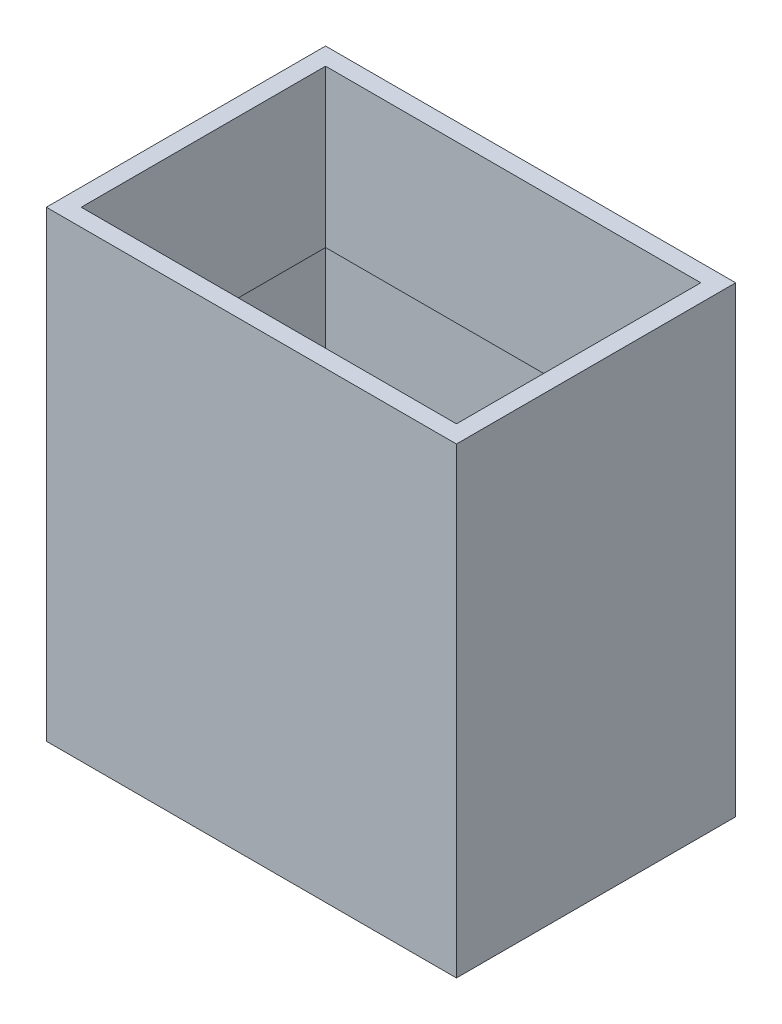
ISO-10303-21;
HEADER;
FILE_DESCRIPTION(('STEP AP214'),'2;1');
FILE_NAME('part.step','',(''),(''),'','','');
FILE_SCHEMA(('AUTOMOTIVE_DESIGN { 1 0 10303 214 1 1 1 1 }'));
ENDSEC;
DATA;
#1=APPLICATION_CONTEXT('core data for automotive mechanical design processes');
#2=APPLICATION_PROTOCOL_DEFINITION('international standard','automotive_design',2000,#1);
#3=PRODUCT_CONTEXT('',#1,'mechanical');
#4=PRODUCT('Part','Part','',(#3));
#5=PRODUCT_RELATED_PRODUCT_CATEGORY('part','',(#4));
#6=PRODUCT_DEFINITION_FORMATION('','',#4);
#7=PRODUCT_DEFINITION_CONTEXT('part definition',#1,'design');
#8=PRODUCT_DEFINITION('design','',#6,#7);
#9=PRODUCT_DEFINITION_SHAPE('','',#8);
#10=(LENGTH_UNIT() NAMED_UNIT(*) SI_UNIT(.MILLI.,.METRE.));
#11=(NAMED_UNIT(*) PLANE_ANGLE_UNIT() SI_UNIT($,.RADIAN.));
#12=(NAMED_UNIT(*) SI_UNIT($,.STERADIAN.) SOLID_ANGLE_UNIT());
#13=UNCERTAINTY_MEASURE_WITH_UNIT(LENGTH_MEASURE(1.E-05),#10,'distance_accuracy_value','');
#14=(GEOMETRIC_REPRESENTATION_CONTEXT(3) GLOBAL_UNCERTAINTY_ASSIGNED_CONTEXT((#13)) GLOBAL_UNIT_ASSIGNED_CONTEXT((#10,
#11,#12)) REPRESENTATION_CONTEXT('',''));
#15=CARTESIAN_POINT('',(0.,0.,0.));
#16=DIRECTION('',(0.,0.,1.));
#17=DIRECTION('',(1.,0.,0.));
#18=AXIS2_PLACEMENT_3D('',#15,#16,#17);
#19=CARTESIAN_POINT('',(0.,28.,0.));
#20=DIRECTION('',(0.,-1.,0.));
#21=DIRECTION('',(0.,0.,-1.));
#22=AXIS2_PLACEMENT_3D('',#19,#20,#21);
#23=PLANE('',#22);
#24=DIRECTION('',(0.,0.,1.));
#25=VECTOR('',#24,1.);
#26=CARTESIAN_POINT('',(0.,28.,0.));
#27=LINE('',#26,#25);
#28=CARTESIAN_POINT('',(0.,28.,-32.));
#29=VERTEX_POINT('',#28);
#30=CARTESIAN_POINT('',(0.,28.,0.));
#31=VERTEX_POINT('',#30);
#32=EDGE_CURVE('E188',#29,#31,#27,.T.);
#33=ORIENTED_EDGE('',*,*,#32,.T.);
#34=DIRECTION('',(1.,0.,0.));
#35=VECTOR('',#34,1.);
#36=CARTESIAN_POINT('',(0.,28.,0.));
#37=LINE('',#36,#35);
#38=CARTESIAN_POINT('',(47.,28.,0.));
#39=VERTEX_POINT('',#38);
#40=EDGE_CURVE('E191',#31,#39,#37,.T.);
#41=ORIENTED_EDGE('',*,*,#40,.T.);
#42=DIRECTION('',(0.,0.,-1.));
#43=VECTOR('',#42,1.);
#44=CARTESIAN_POINT('',(47.,28.,0.));
#45=LINE('',#44,#43);
#46=CARTESIAN_POINT('',(47.,28.,-32.));
#47=VERTEX_POINT('',#46);
#48=EDGE_CURVE('E193',#39,#47,#45,.T.);
#49=ORIENTED_EDGE('',*,*,#48,.T.);
#50=DIRECTION('',(-1.,0.,0.));
#51=VECTOR('',#50,1.);
#52=CARTESIAN_POINT('',(0.,28.,-32.));
#53=LINE('',#52,#51);
#54=EDGE_CURVE('E195',#47,#29,#53,.T.);
#55=ORIENTED_EDGE('',*,*,#54,.T.);
#56=EDGE_LOOP('',(#33,#41,#49,#55));
#57=FACE_BOUND('',#56,.T.);
#58=DIRECTION('',(0.,0.,1.));
#59=VECTOR('',#58,1.);
#60=CARTESIAN_POINT('',(2.,28.,-2.));
#61=LINE('',#60,#59);
#62=CARTESIAN_POINT('',(2.,28.,-30.));
#63=VERTEX_POINT('',#62);
#64=CARTESIAN_POINT('',(2.,28.,-2.));
#65=VERTEX_POINT('',#64);
#66=EDGE_CURVE('E167',#63,#65,#61,.T.);
#67=ORIENTED_EDGE('',*,*,#66,.F.);
#68=DIRECTION('',(-1.,0.,0.));
#69=VECTOR('',#68,1.);
#70=CARTESIAN_POINT('',(2.,28.,-30.));
#71=LINE('',#70,#69);
#72=CARTESIAN_POINT('',(45.,28.,-30.));
#73=VERTEX_POINT('',#72);
#74=EDGE_CURVE('E174',#73,#63,#71,.T.);
#75=ORIENTED_EDGE('',*,*,#74,.F.);
#76=DIRECTION('',(0.,0.,-1.));
#77=VECTOR('',#76,1.);
#78=CARTESIAN_POINT('',(45.,28.,-2.));
#79=LINE('',#78,#77);
#80=CARTESIAN_POINT('',(45.,28.,-2.));
#81=VERTEX_POINT('',#80);
#82=EDGE_CURVE('E171',#81,#73,#79,.T.);
#83=ORIENTED_EDGE('',*,*,#82,.F.);
#84=DIRECTION('',(1.,0.,0.));
#85=VECTOR('',#84,1.);
#86=CARTESIAN_POINT('',(2.,28.,-2.));
#87=LINE('',#86,#85);
#88=EDGE_CURVE('E169',#65,#81,#87,.T.);
#89=ORIENTED_EDGE('',*,*,#88,.F.);
#90=EDGE_LOOP('',(#67,#75,#83,#89));
#91=FACE_BOUND('',#90,.T.);
#92=ADVANCED_FACE('F41',(#57,#91),#23,.F.);
#93=CARTESIAN_POINT('',(0.,28.,0.));
#94=DIRECTION('',(1.,0.,0.));
#95=DIRECTION('',(0.,0.,-1.));
#96=AXIS2_PLACEMENT_3D('',#93,#94,#95);
#97=PLANE('',#96);
#98=DIRECTION('',(0.,-1.,0.));
#99=VECTOR('',#98,1.);
#100=CARTESIAN_POINT('',(0.,28.,-32.));
#101=LINE('',#100,#99);
#102=CARTESIAN_POINT('',(0.,-25.,-32.));
#103=VERTEX_POINT('',#102);
#104=EDGE_CURVE('E197',#29,#103,#101,.T.);
#105=ORIENTED_EDGE('',*,*,#104,.T.);
#106=DIRECTION('',(0.,0.,-1.));
#107=VECTOR('',#106,1.);
#108=CARTESIAN_POINT('',(0.,-25.,-32.));
#109=LINE('',#108,#107);
#110=CARTESIAN_POINT('',(0.,-25.,0.));
#111=VERTEX_POINT('',#110);
#112=EDGE_CURVE('E145',#111,#103,#109,.T.);
#113=ORIENTED_EDGE('',*,*,#112,.F.);
#114=DIRECTION('',(0.,-1.,0.));
#115=VECTOR('',#114,1.);
#116=CARTESIAN_POINT('',(0.,28.,0.));
#117=LINE('',#116,#115);
#118=EDGE_CURVE('E203',#31,#111,#117,.T.);
#119=ORIENTED_EDGE('',*,*,#118,.F.);
#120=ORIENTED_EDGE('',*,*,#32,.F.);
#121=EDGE_LOOP('',(#105,#113,#119,#120));
#122=FACE_BOUND('',#121,.T.);
#123=ADVANCED_FACE('F43',(#122),#97,.F.);
#124=CARTESIAN_POINT('',(0.,28.,0.));
#125=DIRECTION('',(0.,0.,-1.));
#126=DIRECTION('',(-1.,0.,0.));
#127=AXIS2_PLACEMENT_3D('',#124,#125,#126);
#128=PLANE('',#127);
#129=ORIENTED_EDGE('',*,*,#118,.T.);
#130=DIRECTION('',(-1.,0.,0.));
#131=VECTOR('',#130,1.);
#132=CARTESIAN_POINT('',(0.,-25.,0.));
#133=LINE('',#132,#131);
#134=CARTESIAN_POINT('',(47.,-25.,0.));
#135=VERTEX_POINT('',#134);
#136=EDGE_CURVE('E263',#135,#111,#133,.T.);
#137=ORIENTED_EDGE('',*,*,#136,.F.);
#138=DIRECTION('',(0.,-1.,0.));
#139=VECTOR('',#138,1.);
#140=CARTESIAN_POINT('',(47.,28.,0.));
#141=LINE('',#140,#139);
#142=EDGE_CURVE('E201',#39,#135,#141,.T.);
#143=ORIENTED_EDGE('',*,*,#142,.F.);
#144=ORIENTED_EDGE('',*,*,#40,.F.);
#145=EDGE_LOOP('',(#129,#137,#143,#144));
#146=FACE_BOUND('',#145,.T.);
#147=ADVANCED_FACE('F297',(#146),#128,.F.);
#148=CARTESIAN_POINT('',(47.,28.,0.));
#149=DIRECTION('',(-1.,0.,0.));
#150=DIRECTION('',(0.,0.,1.));
#151=AXIS2_PLACEMENT_3D('',#148,#149,#150);
#152=PLANE('',#151);
#153=ORIENTED_EDGE('',*,*,#142,.T.);
#154=DIRECTION('',(0.,0.,1.));
#155=VECTOR('',#154,1.);
#156=CARTESIAN_POINT('',(47.,-25.,-32.));
#157=LINE('',#156,#155);
#158=CARTESIAN_POINT('',(47.,-25.,-32.));
#159=VERTEX_POINT('',#158);
#160=EDGE_CURVE('E260',#159,#135,#157,.T.);
#161=ORIENTED_EDGE('',*,*,#160,.F.);
#162=DIRECTION('',(0.,-1.,0.));
#163=VECTOR('',#162,1.);
#164=CARTESIAN_POINT('',(47.,28.,-32.));
#165=LINE('',#164,#163);
#166=EDGE_CURVE('E199',#47,#159,#165,.T.);
#167=ORIENTED_EDGE('',*,*,#166,.F.);
#168=ORIENTED_EDGE('',*,*,#48,.F.);
#169=EDGE_LOOP('',(#153,#161,#167,#168));
#170=FACE_BOUND('',#169,.T.);
#171=ADVANCED_FACE('F307',(#170),#152,.F.);
#172=CARTESIAN_POINT('',(0.,28.,-32.));
#173=DIRECTION('',(0.,0.,1.));
#174=DIRECTION('',(1.,0.,0.));
#175=AXIS2_PLACEMENT_3D('',#172,#173,#174);
#176=PLANE('',#175);
#177=ORIENTED_EDGE('',*,*,#166,.T.);
#178=DIRECTION('',(1.,0.,0.));
#179=VECTOR('',#178,1.);
#180=CARTESIAN_POINT('',(0.,-25.,-32.));
#181=LINE('',#180,#179);
#182=EDGE_CURVE('E257',#103,#159,#181,.T.);
#183=ORIENTED_EDGE('',*,*,#182,.F.);
#184=ORIENTED_EDGE('',*,*,#104,.F.);
#185=ORIENTED_EDGE('',*,*,#54,.F.);
#186=EDGE_LOOP('',(#177,#183,#184,#185));
#187=FACE_BOUND('',#186,.T.);
#188=ADVANCED_FACE('F304',(#187),#176,.F.);
#189=CARTESIAN_POINT('',(2.,28.,-2.));
#190=DIRECTION('',(1.,0.,0.));
#191=DIRECTION('',(0.,0.,-1.));
#192=AXIS2_PLACEMENT_3D('',#189,#190,#191);
#193=PLANE('',#192);
#194=DIRECTION('',(0.,0.,1.));
#195=VECTOR('',#194,1.);
#196=CARTESIAN_POINT('',(2.,10.,-2.));
#197=LINE('',#196,#195);
#198=CARTESIAN_POINT('',(2.,10.,-30.));
#199=VERTEX_POINT('',#198);
#200=CARTESIAN_POINT('',(2.,10.,-2.));
#201=VERTEX_POINT('',#200);
#202=EDGE_CURVE('E165',#199,#201,#197,.T.);
#203=ORIENTED_EDGE('',*,*,#202,.F.);
#204=DIRECTION('',(0.,-1.,0.));
#205=VECTOR('',#204,1.);
#206=CARTESIAN_POINT('',(2.,28.,-30.));
#207=LINE('',#206,#205);
#208=EDGE_CURVE('E176',#63,#199,#207,.T.);
#209=ORIENTED_EDGE('',*,*,#208,.F.);
#210=ORIENTED_EDGE('',*,*,#66,.T.);
#211=DIRECTION('',(0.,-1.,0.));
#212=VECTOR('',#211,1.);
#213=CARTESIAN_POINT('',(2.,28.,-2.));
#214=LINE('',#213,#212);
#215=EDGE_CURVE('E185',#65,#201,#214,.T.);
#216=ORIENTED_EDGE('',*,*,#215,.T.);
#217=EDGE_LOOP('',(#203,#209,#210,#216));
#218=FACE_BOUND('',#217,.T.);
#219=ADVANCED_FACE('F302',(#218),#193,.T.);
#220=CARTESIAN_POINT('',(2.,28.,-2.));
#221=DIRECTION('',(0.,0.,-1.));
#222=DIRECTION('',(-1.,0.,0.));
#223=AXIS2_PLACEMENT_3D('',#220,#221,#222);
#224=PLANE('',#223);
#225=DIRECTION('',(1.,0.,0.));
#226=VECTOR('',#225,1.);
#227=CARTESIAN_POINT('',(2.,10.,-2.));
#228=LINE('',#227,#226);
#229=CARTESIAN_POINT('',(45.,10.,-2.));
#230=VERTEX_POINT('',#229);
#231=EDGE_CURVE('E163',#201,#230,#228,.T.);
#232=ORIENTED_EDGE('',*,*,#231,.F.);
#233=ORIENTED_EDGE('',*,*,#215,.F.);
#234=ORIENTED_EDGE('',*,*,#88,.T.);
#235=DIRECTION('',(0.,-1.,0.));
#236=VECTOR('',#235,1.);
#237=CARTESIAN_POINT('',(45.,28.,-2.));
#238=LINE('',#237,#236);
#239=EDGE_CURVE('E182',#81,#230,#238,.T.);
#240=ORIENTED_EDGE('',*,*,#239,.T.);
#241=EDGE_LOOP('',(#232,#233,#234,#240));
#242=FACE_BOUND('',#241,.T.);
#243=ADVANCED_FACE('F544',(#242),#224,.T.);
#244=CARTESIAN_POINT('',(45.,28.,-2.));
#245=DIRECTION('',(-1.,0.,0.));
#246=DIRECTION('',(0.,0.,1.));
#247=AXIS2_PLACEMENT_3D('',#244,#245,#246);
#248=PLANE('',#247);
#249=DIRECTION('',(0.,0.,-1.));
#250=VECTOR('',#249,1.);
#251=CARTESIAN_POINT('',(45.,10.,-2.));
#252=LINE('',#251,#250);
#253=CARTESIAN_POINT('',(45.,10.,-30.));
#254=VERTEX_POINT('',#253);
#255=EDGE_CURVE('E64',#230,#254,#252,.T.);
#256=ORIENTED_EDGE('',*,*,#255,.F.);
#257=ORIENTED_EDGE('',*,*,#239,.F.);
#258=ORIENTED_EDGE('',*,*,#82,.T.);
#259=DIRECTION('',(0.,-1.,0.));
#260=VECTOR('',#259,1.);
#261=CARTESIAN_POINT('',(45.,28.,-30.));
#262=LINE('',#261,#260);
#263=EDGE_CURVE('E179',#73,#254,#262,.T.);
#264=ORIENTED_EDGE('',*,*,#263,.T.);
#265=EDGE_LOOP('',(#256,#257,#258,#264));
#266=FACE_BOUND('',#265,.T.);
#267=ADVANCED_FACE('F534',(#266),#248,.T.);
#268=CARTESIAN_POINT('',(2.,28.,-30.));
#269=DIRECTION('',(0.,0.,1.));
#270=DIRECTION('',(1.,0.,0.));
#271=AXIS2_PLACEMENT_3D('',#268,#269,#270);
#272=PLANE('',#271);
#273=DIRECTION('',(-1.,0.,0.));
#274=VECTOR('',#273,1.);
#275=CARTESIAN_POINT('',(2.,10.,-30.));
#276=LINE('',#275,#274);
#277=EDGE_CURVE('E136',#254,#199,#276,.T.);
#278=ORIENTED_EDGE('',*,*,#277,.F.);
#279=ORIENTED_EDGE('',*,*,#263,.F.);
#280=ORIENTED_EDGE('',*,*,#74,.T.);
#281=ORIENTED_EDGE('',*,*,#208,.T.);
#282=EDGE_LOOP('',(#278,#279,#280,#281));
#283=FACE_BOUND('',#282,.T.);
#284=ADVANCED_FACE('F525',(#283),#272,.T.);
#285=CARTESIAN_POINT('',(1.5,10.,-30.5));
#286=DIRECTION('',(-1.,0.,0.));
#287=DIRECTION('',(0.,0.,1.));
#288=AXIS2_PLACEMENT_3D('',#285,#286,#287);
#289=PLANE('',#288);
#290=DIRECTION('',(0.,-1.,0.));
#291=VECTOR('',#290,1.);
#292=CARTESIAN_POINT('',(1.5,10.,-1.5));
#293=LINE('',#292,#291);
#294=CARTESIAN_POINT('',(1.5,10.,-1.5));
#295=VERTEX_POINT('',#294);
#296=CARTESIAN_POINT('',(1.5,-22.,-1.5));
#297=VERTEX_POINT('',#296);
#298=EDGE_CURVE('E144',#295,#297,#293,.T.);
#299=ORIENTED_EDGE('',*,*,#298,.T.);
#300=DIRECTION('',(0.,0.,-1.));
#301=VECTOR('',#300,1.);
#302=CARTESIAN_POINT('',(1.5,-22.,-30.5));
#303=LINE('',#302,#301);
#304=CARTESIAN_POINT('',(1.5,-22.,-30.5));
#305=VERTEX_POINT('',#304);
#306=EDGE_CURVE('E130',#297,#305,#303,.T.);
#307=ORIENTED_EDGE('',*,*,#306,.T.);
#308=DIRECTION('',(0.,-1.,0.));
#309=VECTOR('',#308,1.);
#310=CARTESIAN_POINT('',(1.5,10.,-30.5));
#311=LINE('',#310,#309);
#312=CARTESIAN_POINT('',(1.5,10.,-30.5));
#313=VERTEX_POINT('',#312);
#314=EDGE_CURVE('E142',#313,#305,#311,.T.);
#315=ORIENTED_EDGE('',*,*,#314,.F.);
#316=DIRECTION('',(0.,0.,-1.));
#317=VECTOR('',#316,1.);
#318=CARTESIAN_POINT('',(1.5,10.,-30.5));
#319=LINE('',#318,#317);
#320=EDGE_CURVE('E266',#295,#313,#319,.T.);
#321=ORIENTED_EDGE('',*,*,#320,.F.);
#322=EDGE_LOOP('',(#299,#307,#315,#321));
#323=FACE_BOUND('',#322,.T.);
#324=ADVANCED_FACE('F140',(#323),#289,.F.);
#325=CARTESIAN_POINT('',(1.5,10.,-1.5));
#326=DIRECTION('',(0.,0.,1.));
#327=DIRECTION('',(1.,0.,0.));
#328=AXIS2_PLACEMENT_3D('',#325,#326,#327);
#329=PLANE('',#328);
#330=DIRECTION('',(0.,-1.,0.));
#331=VECTOR('',#330,1.);
#332=CARTESIAN_POINT('',(45.5,10.,-1.5));
#333=LINE('',#332,#331);
#334=CARTESIAN_POINT('',(45.5,10.,-1.5));
#335=VERTEX_POINT('',#334);
#336=CARTESIAN_POINT('',(45.5,-22.,-1.5));
#337=VERTEX_POINT('',#336);
#338=EDGE_CURVE('E155',#335,#337,#333,.T.);
#339=ORIENTED_EDGE('',*,*,#338,.T.);
#340=DIRECTION('',(-1.,0.,0.));
#341=VECTOR('',#340,1.);
#342=CARTESIAN_POINT('',(1.5,-22.,-1.5));
#343=LINE('',#342,#341);
#344=EDGE_CURVE('E146',#337,#297,#343,.T.);
#345=ORIENTED_EDGE('',*,*,#344,.T.);
#346=ORIENTED_EDGE('',*,*,#298,.F.);
#347=DIRECTION('',(-1.,0.,0.));
#348=VECTOR('',#347,1.);
#349=CARTESIAN_POINT('',(1.5,10.,-1.5));
#350=LINE('',#349,#348);
#351=EDGE_CURVE('E153',#335,#295,#350,.T.);
#352=ORIENTED_EDGE('',*,*,#351,.F.);
#353=EDGE_LOOP('',(#339,#345,#346,#352));
#354=FACE_BOUND('',#353,.T.);
#355=ADVANCED_FACE('F274',(#354),#329,.F.);
#356=CARTESIAN_POINT('',(45.5,10.,-30.5));
#357=DIRECTION('',(1.,0.,0.));
#358=DIRECTION('',(0.,0.,-1.));
#359=AXIS2_PLACEMENT_3D('',#356,#357,#358);
#360=PLANE('',#359);
#361=DIRECTION('',(0.,-1.,0.));
#362=VECTOR('',#361,1.);
#363=CARTESIAN_POINT('',(45.5,10.,-30.5));
#364=LINE('',#363,#362);
#365=CARTESIAN_POINT('',(45.5,10.,-30.5));
#366=VERTEX_POINT('',#365);
#367=CARTESIAN_POINT('',(45.5,-22.,-30.5));
#368=VERTEX_POINT('',#367);
#369=EDGE_CURVE('E152',#366,#368,#364,.T.);
#370=ORIENTED_EDGE('',*,*,#369,.T.);
#371=DIRECTION('',(0.,0.,1.));
#372=VECTOR('',#371,1.);
#373=CARTESIAN_POINT('',(45.5,-22.,-30.5));
#374=LINE('',#373,#372);
#375=EDGE_CURVE('E56',#368,#337,#374,.T.);
#376=ORIENTED_EDGE('',*,*,#375,.T.);
#377=ORIENTED_EDGE('',*,*,#338,.F.);
#378=DIRECTION('',(0.,0.,1.));
#379=VECTOR('',#378,1.);
#380=CARTESIAN_POINT('',(45.5,10.,-30.5));
#381=LINE('',#380,#379);
#382=EDGE_CURVE('E158',#366,#335,#381,.T.);
#383=ORIENTED_EDGE('',*,*,#382,.F.);
#384=EDGE_LOOP('',(#370,#376,#377,#383));
#385=FACE_BOUND('',#384,.T.);
#386=ADVANCED_FACE('F277',(#385),#360,.F.);
#387=CARTESIAN_POINT('',(1.5,10.,-30.5));
#388=DIRECTION('',(0.,0.,-1.));
#389=DIRECTION('',(-1.,0.,0.));
#390=AXIS2_PLACEMENT_3D('',#387,#388,#389);
#391=PLANE('',#390);
#392=ORIENTED_EDGE('',*,*,#314,.T.);
#393=DIRECTION('',(1.,0.,0.));
#394=VECTOR('',#393,1.);
#395=CARTESIAN_POINT('',(1.5,-22.,-30.5));
#396=LINE('',#395,#394);
#397=EDGE_CURVE('E127',#305,#368,#396,.T.);
#398=ORIENTED_EDGE('',*,*,#397,.T.);
#399=ORIENTED_EDGE('',*,*,#369,.F.);
#400=DIRECTION('',(1.,0.,0.));
#401=VECTOR('',#400,1.);
#402=CARTESIAN_POINT('',(1.5,10.,-30.5));
#403=LINE('',#402,#401);
#404=EDGE_CURVE('E150',#313,#366,#403,.T.);
#405=ORIENTED_EDGE('',*,*,#404,.F.);
#406=EDGE_LOOP('',(#392,#398,#399,#405));
#407=FACE_BOUND('',#406,.T.);
#408=ADVANCED_FACE('F148',(#407),#391,.F.);
#409=CARTESIAN_POINT('',(0.,10.,0.));
#410=DIRECTION('',(0.,1.,0.));
#411=DIRECTION('',(0.,0.,1.));
#412=AXIS2_PLACEMENT_3D('',#409,#410,#411);
#413=PLANE('',#412);
#414=ORIENTED_EDGE('',*,*,#202,.T.);
#415=ORIENTED_EDGE('',*,*,#231,.T.);
#416=ORIENTED_EDGE('',*,*,#255,.T.);
#417=ORIENTED_EDGE('',*,*,#277,.T.);
#418=EDGE_LOOP('',(#414,#415,#416,#417));
#419=FACE_BOUND('',#418,.T.);
#420=ORIENTED_EDGE('',*,*,#320,.T.);
#421=ORIENTED_EDGE('',*,*,#404,.T.);
#422=ORIENTED_EDGE('',*,*,#382,.T.);
#423=ORIENTED_EDGE('',*,*,#351,.T.);
#424=EDGE_LOOP('',(#420,#421,#422,#423));
#425=FACE_BOUND('',#424,.T.);
#426=ADVANCED_FACE('F279',(#419,#425),#413,.F.);
#427=CARTESIAN_POINT('',(0.,-25.,0.));
#428=DIRECTION('',(0.,1.,0.));
#429=DIRECTION('',(0.,0.,1.));
#430=AXIS2_PLACEMENT_3D('',#427,#428,#429);
#431=PLANE('',#430);
#432=ORIENTED_EDGE('',*,*,#112,.T.);
#433=ORIENTED_EDGE('',*,*,#182,.T.);
#434=ORIENTED_EDGE('',*,*,#160,.T.);
#435=ORIENTED_EDGE('',*,*,#136,.T.);
#436=EDGE_LOOP('',(#432,#433,#434,#435));
#437=FACE_BOUND('',#436,.T.);
#438=CARTESIAN_POINT('',(23.5,-25.,-16.));
#439=DIRECTION('',(0.,-1.,0.));
#440=DIRECTION('',(0.,0.,-1.));
#441=AXIS2_PLACEMENT_3D('',#438,#439,#440);
#442=CIRCLE('',#441,6.50000000000001);
#443=CARTESIAN_POINT('',(23.5,-25.,-22.5));
#444=VERTEX_POINT('',#443);
#445=EDGE_CURVE('E209',#444,#444,#442,.T.);
#446=ORIENTED_EDGE('',*,*,#445,.F.);
#447=EDGE_LOOP('',(#446));
#448=FACE_BOUND('',#447,.T.);
#449=ADVANCED_FACE('F281',(#437,#448),#431,.F.);
#450=CARTESIAN_POINT('',(0.,-22.,0.));
#451=DIRECTION('',(0.,1.,0.));
#452=DIRECTION('',(0.,0.,1.));
#453=AXIS2_PLACEMENT_3D('',#450,#451,#452);
#454=PLANE('',#453);
#455=CARTESIAN_POINT('',(37.,-22.,-16.));
#456=DIRECTION('',(0.,1.,0.));
#457=DIRECTION('',(0.,0.,1.));
#458=AXIS2_PLACEMENT_3D('',#455,#456,#457);
#459=CIRCLE('',#458,5.);
#460=CARTESIAN_POINT('',(37.,-22.,-11.));
#461=VERTEX_POINT('',#460);
#462=EDGE_CURVE('E213',#461,#461,#459,.T.);
#463=ORIENTED_EDGE('',*,*,#462,.F.);
#464=EDGE_LOOP('',(#463));
#465=FACE_BOUND('',#464,.T.);
#466=CARTESIAN_POINT('',(10.,-22.,-16.));
#467=DIRECTION('',(0.,1.,0.));
#468=DIRECTION('',(0.,0.,1.));
#469=AXIS2_PLACEMENT_3D('',#466,#467,#468);
#470=CIRCLE('',#469,5.);
#471=CARTESIAN_POINT('',(10.,-22.,-11.));
#472=VERTEX_POINT('',#471);
#473=EDGE_CURVE('E135',#472,#472,#470,.T.);
#474=ORIENTED_EDGE('',*,*,#473,.F.);
#475=EDGE_LOOP('',(#474));
#476=FACE_BOUND('',#475,.T.);
#477=CARTESIAN_POINT('',(23.5,-22.,-16.));
#478=DIRECTION('',(0.,-1.,0.));
#479=DIRECTION('',(0.,0.,-1.));
#480=AXIS2_PLACEMENT_3D('',#477,#478,#479);
#481=CIRCLE('',#480,6.50000000000001);
#482=CARTESIAN_POINT('',(23.5,-22.,-22.5));
#483=VERTEX_POINT('',#482);
#484=EDGE_CURVE('E248',#483,#483,#481,.T.);
#485=ORIENTED_EDGE('',*,*,#484,.T.);
#486=EDGE_LOOP('',(#485));
#487=FACE_BOUND('',#486,.T.);
#488=ORIENTED_EDGE('',*,*,#306,.F.);
#489=ORIENTED_EDGE('',*,*,#344,.F.);
#490=ORIENTED_EDGE('',*,*,#375,.F.);
#491=ORIENTED_EDGE('',*,*,#397,.F.);
#492=EDGE_LOOP('',(#488,#489,#490,#491));
#493=FACE_BOUND('',#492,.T.);
#494=ADVANCED_FACE('F129',(#465,#476,#487,#493),#454,.T.);
#495=CARTESIAN_POINT('',(23.5,-22.,-16.));
#496=DIRECTION('',(0.,-1.,0.));
#497=DIRECTION('',(0.,0.,-1.));
#498=AXIS2_PLACEMENT_3D('',#495,#496,#497);
#499=CYLINDRICAL_SURFACE('',#498,6.50000000000001);
#500=ORIENTED_EDGE('',*,*,#484,.F.);
#501=EDGE_LOOP('',(#500));
#502=FACE_BOUND('',#501,.T.);
#503=ORIENTED_EDGE('',*,*,#445,.T.);
#504=EDGE_LOOP('',(#503));
#505=FACE_BOUND('',#504,.T.);
#506=ADVANCED_FACE('F329',(#502,#505),#499,.F.);
#507=CARTESIAN_POINT('',(10.,-20.,-16.));
#508=DIRECTION('',(0.,-1.,0.));
#509=DIRECTION('',(0.,0.,-1.));
#510=AXIS2_PLACEMENT_3D('',#507,#508,#509);
#511=CYLINDRICAL_SURFACE('',#510,5.);
#512=ORIENTED_EDGE('',*,*,#473,.T.);
#513=EDGE_LOOP('',(#512));
#514=FACE_BOUND('',#513,.T.);
#515=CARTESIAN_POINT('',(10.,-20.,-16.));
#516=DIRECTION('',(0.,-1.,0.));
#517=DIRECTION('',(0.,0.,-1.));
#518=AXIS2_PLACEMENT_3D('',#515,#516,#517);
#519=CIRCLE('',#518,5.);
#520=CARTESIAN_POINT('',(10.,-20.,-21.));
#521=VERTEX_POINT('',#520);
#522=EDGE_CURVE('E210',#521,#521,#519,.T.);
#523=ORIENTED_EDGE('',*,*,#522,.T.);
#524=EDGE_LOOP('',(#523));
#525=FACE_BOUND('',#524,.T.);
#526=ADVANCED_FACE('F331',(#514,#525),#511,.T.);
#527=CARTESIAN_POINT('',(10.,-20.,-16.));
#528=DIRECTION('',(0.,-1.,0.));
#529=DIRECTION('',(0.,0.,-1.));
#530=AXIS2_PLACEMENT_3D('',#527,#528,#529);
#531=PLANE('',#530);
#532=CARTESIAN_POINT('',(10.,-20.,-16.));
#533=DIRECTION('',(0.,-1.,0.));
#534=DIRECTION('',(0.,0.,-1.));
#535=AXIS2_PLACEMENT_3D('',#532,#533,#534);
#536=CIRCLE('',#535,4.);
#537=CARTESIAN_POINT('',(10.,-20.,-20.));
#538=VERTEX_POINT('',#537);
#539=EDGE_CURVE('E217',#538,#538,#536,.T.);
#540=ORIENTED_EDGE('',*,*,#539,.T.);
#541=EDGE_LOOP('',(#540));
#542=FACE_BOUND('',#541,.T.);
#543=ORIENTED_EDGE('',*,*,#522,.F.);
#544=EDGE_LOOP('',(#543));
#545=FACE_BOUND('',#544,.T.);
#546=ADVANCED_FACE('F237',(#542,#545),#531,.F.);
#547=CARTESIAN_POINT('',(10.,-20.,-16.));
#548=DIRECTION('',(0.,-1.,0.));
#549=DIRECTION('',(0.,0.,-1.));
#550=AXIS2_PLACEMENT_3D('',#547,#548,#549);
#551=CYLINDRICAL_SURFACE('',#550,4.);
#552=CARTESIAN_POINT('',(10.,-22.,-16.));
#553=DIRECTION('',(0.,1.,0.));
#554=DIRECTION('',(0.,0.,1.));
#555=AXIS2_PLACEMENT_3D('',#552,#553,#554);
#556=CIRCLE('',#555,4.);
#557=CARTESIAN_POINT('',(10.,-22.,-12.));
#558=VERTEX_POINT('',#557);
#559=EDGE_CURVE('E206',#558,#558,#556,.T.);
#560=ORIENTED_EDGE('',*,*,#559,.F.);
#561=EDGE_LOOP('',(#560));
#562=FACE_BOUND('',#561,.T.);
#563=ORIENTED_EDGE('',*,*,#539,.F.);
#564=EDGE_LOOP('',(#563));
#565=FACE_BOUND('',#564,.T.);
#566=ADVANCED_FACE('F230',(#562,#565),#551,.F.);
#567=CARTESIAN_POINT('',(10.,-22.,-16.));
#568=DIRECTION('',(0.,1.,0.));
#569=DIRECTION('',(0.,0.,1.));
#570=AXIS2_PLACEMENT_3D('',#567,#568,#569);
#571=CIRCLE('',#570,2.65);
#572=CARTESIAN_POINT('',(10.,-22.,-13.35));
#573=VERTEX_POINT('',#572);
#574=EDGE_CURVE('E49',#573,#573,#571,.T.);
#575=ORIENTED_EDGE('',*,*,#574,.F.);
#576=EDGE_LOOP('',(#575));
#577=FACE_BOUND('',#576,.T.);
#578=ORIENTED_EDGE('',*,*,#559,.T.);
#579=EDGE_LOOP('',(#578));
#580=FACE_BOUND('',#579,.T.);
#581=ADVANCED_FACE('F226',(#577,#580),#454,.T.);
#582=CARTESIAN_POINT('',(37.,-20.,-16.));
#583=DIRECTION('',(0.,-1.,0.));
#584=DIRECTION('',(0.,0.,-1.));
#585=AXIS2_PLACEMENT_3D('',#582,#583,#584);
#586=CYLINDRICAL_SURFACE('',#585,5.);
#587=ORIENTED_EDGE('',*,*,#462,.T.);
#588=EDGE_LOOP('',(#587));
#589=FACE_BOUND('',#588,.T.);
#590=CARTESIAN_POINT('',(37.,-20.,-16.));
#591=DIRECTION('',(0.,-1.,0.));
#592=DIRECTION('',(0.,0.,-1.));
#593=AXIS2_PLACEMENT_3D('',#590,#591,#592);
#594=CIRCLE('',#593,5.);
#595=CARTESIAN_POINT('',(37.,-20.,-21.));
#596=VERTEX_POINT('',#595);
#597=EDGE_CURVE('E379',#596,#596,#594,.T.);
#598=ORIENTED_EDGE('',*,*,#597,.T.);
#599=EDGE_LOOP('',(#598));
#600=FACE_BOUND('',#599,.T.);
#601=ADVANCED_FACE('F229',(#589,#600),#586,.T.);
#602=CARTESIAN_POINT('',(37.,-20.,-16.));
#603=DIRECTION('',(0.,-1.,0.));
#604=DIRECTION('',(0.,0.,-1.));
#605=AXIS2_PLACEMENT_3D('',#602,#603,#604);
#606=PLANE('',#605);
#607=CARTESIAN_POINT('',(37.,-20.,-16.));
#608=DIRECTION('',(0.,-1.,0.));
#609=DIRECTION('',(0.,0.,-1.));
#610=AXIS2_PLACEMENT_3D('',#607,#608,#609);
#611=CIRCLE('',#610,4.);
#612=CARTESIAN_POINT('',(37.,-20.,-20.));
#613=VERTEX_POINT('',#612);
#614=EDGE_CURVE('E218',#613,#613,#611,.T.);
#615=ORIENTED_EDGE('',*,*,#614,.T.);
#616=EDGE_LOOP('',(#615));
#617=FACE_BOUND('',#616,.T.);
#618=ORIENTED_EDGE('',*,*,#597,.F.);
#619=EDGE_LOOP('',(#618));
#620=FACE_BOUND('',#619,.T.);
#621=ADVANCED_FACE('F348',(#617,#620),#606,.F.);
#622=CARTESIAN_POINT('',(37.,-20.,-16.));
#623=DIRECTION('',(0.,-1.,0.));
#624=DIRECTION('',(0.,0.,-1.));
#625=AXIS2_PLACEMENT_3D('',#622,#623,#624);
#626=CYLINDRICAL_SURFACE('',#625,4.);
#627=CARTESIAN_POINT('',(37.,-22.,-16.));
#628=DIRECTION('',(0.,1.,0.));
#629=DIRECTION('',(0.,0.,1.));
#630=AXIS2_PLACEMENT_3D('',#627,#628,#629);
#631=CIRCLE('',#630,4.);
#632=CARTESIAN_POINT('',(37.,-22.,-12.));
#633=VERTEX_POINT('',#632);
#634=EDGE_CURVE('E214',#633,#633,#631,.T.);
#635=ORIENTED_EDGE('',*,*,#634,.F.);
#636=EDGE_LOOP('',(#635));
#637=FACE_BOUND('',#636,.T.);
#638=ORIENTED_EDGE('',*,*,#614,.F.);
#639=EDGE_LOOP('',(#638));
#640=FACE_BOUND('',#639,.T.);
#641=ADVANCED_FACE('F345',(#637,#640),#626,.F.);
#642=CARTESIAN_POINT('',(37.,-22.,-16.));
#643=DIRECTION('',(0.,1.,0.));
#644=DIRECTION('',(0.,0.,1.));
#645=AXIS2_PLACEMENT_3D('',#642,#643,#644);
#646=CIRCLE('',#645,2.64999999999999);
#647=CARTESIAN_POINT('',(37.,-22.,-13.35));
#648=VERTEX_POINT('',#647);
#649=EDGE_CURVE('E12',#648,#648,#646,.T.);
#650=ORIENTED_EDGE('',*,*,#649,.F.);
#651=EDGE_LOOP('',(#650));
#652=FACE_BOUND('',#651,.T.);
#653=ORIENTED_EDGE('',*,*,#634,.T.);
#654=EDGE_LOOP('',(#653));
#655=FACE_BOUND('',#654,.T.);
#656=ADVANCED_FACE('F232',(#652,#655),#454,.T.);
#657=CARTESIAN_POINT('',(10.,-20.,-16.));
#658=DIRECTION('',(0.,-1.,0.));
#659=DIRECTION('',(0.,0.,-1.));
#660=AXIS2_PLACEMENT_3D('',#657,#658,#659);
#661=CYLINDRICAL_SURFACE('',#660,2.65);
#662=ORIENTED_EDGE('',*,*,#574,.T.);
#663=EDGE_LOOP('',(#662));
#664=FACE_BOUND('',#663,.T.);
#665=CARTESIAN_POINT('',(10.,-20.,-16.));
#666=DIRECTION('',(0.,-1.,0.));
#667=DIRECTION('',(0.,0.,-1.));
#668=AXIS2_PLACEMENT_3D('',#665,#666,#667);
#669=CIRCLE('',#668,2.65);
#670=CARTESIAN_POINT('',(10.,-20.,-18.65));
#671=VERTEX_POINT('',#670);
#672=EDGE_CURVE('E376',#671,#671,#669,.T.);
#673=ORIENTED_EDGE('',*,*,#672,.T.);
#674=EDGE_LOOP('',(#673));
#675=FACE_BOUND('',#674,.T.);
#676=ADVANCED_FACE('F223',(#664,#675),#661,.T.);
#677=CARTESIAN_POINT('',(10.,-20.,-16.));
#678=DIRECTION('',(0.,-1.,0.));
#679=DIRECTION('',(0.,0.,-1.));
#680=AXIS2_PLACEMENT_3D('',#677,#678,#679);
#681=PLANE('',#680);
#682=ORIENTED_EDGE('',*,*,#672,.F.);
#683=EDGE_LOOP('',(#682));
#684=FACE_BOUND('',#683,.T.);
#685=ADVANCED_FACE('F358',(#684),#681,.F.);
#686=CARTESIAN_POINT('',(37.,-20.,-16.));
#687=DIRECTION('',(0.,-1.,0.));
#688=DIRECTION('',(0.,0.,-1.));
#689=AXIS2_PLACEMENT_3D('',#686,#687,#688);
#690=CYLINDRICAL_SURFACE('',#689,2.64999999999999);
#691=ORIENTED_EDGE('',*,*,#649,.T.);
#692=EDGE_LOOP('',(#691));
#693=FACE_BOUND('',#692,.T.);
#694=CARTESIAN_POINT('',(37.,-20.,-16.));
#695=DIRECTION('',(0.,-1.,0.));
#696=DIRECTION('',(0.,0.,-1.));
#697=AXIS2_PLACEMENT_3D('',#694,#695,#696);
#698=CIRCLE('',#697,2.64999999999999);
#699=CARTESIAN_POINT('',(37.,-20.,-18.65));
#700=VERTEX_POINT('',#699);
#701=EDGE_CURVE('E375',#700,#700,#698,.T.);
#702=ORIENTED_EDGE('',*,*,#701,.T.);
#703=EDGE_LOOP('',(#702));
#704=FACE_BOUND('',#703,.T.);
#705=ADVANCED_FACE('F361',(#693,#704),#690,.T.);
#706=CARTESIAN_POINT('',(37.,-20.,-16.));
#707=DIRECTION('',(0.,-1.,0.));
#708=DIRECTION('',(0.,0.,-1.));
#709=AXIS2_PLACEMENT_3D('',#706,#707,#708);
#710=PLANE('',#709);
#711=ORIENTED_EDGE('',*,*,#701,.F.);
#712=EDGE_LOOP('',(#711));
#713=FACE_BOUND('',#712,.T.);
#714=ADVANCED_FACE('F363',(#713),#710,.F.);
#715=CLOSED_SHELL('',(#92,#123,#147,#171,#188,#219,#243,#267,#284,#324,#355,#386,#408,#426,#449,
#494,#506,#526,#546,#566,#581,#601,#621,#641,#656,#676,#685,#705,#714));
#716=MANIFOLD_SOLID_BREP('B2',#715);
#717=ADVANCED_BREP_SHAPE_REPRESENTATION('',(#18,#716),#14);
#718=SHAPE_DEFINITION_REPRESENTATION(#9,#717);
ENDSEC;
END-ISO-10303-21;
